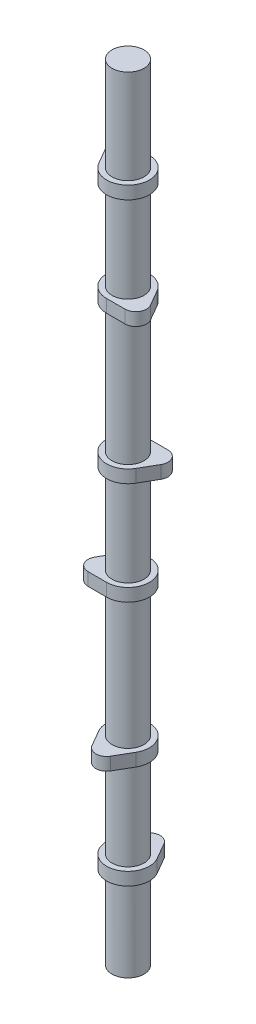
ISO-10303-21;
HEADER;
FILE_DESCRIPTION(('STEP AP214'),'2;1');
FILE_NAME('part.step','',(''),(''),'','','');
FILE_SCHEMA(('AUTOMOTIVE_DESIGN { 1 0 10303 214 1 1 1 1 }'));
ENDSEC;
DATA;
#1=APPLICATION_CONTEXT('core data for automotive mechanical design processes');
#2=APPLICATION_PROTOCOL_DEFINITION('international standard','automotive_design',2000,#1);
#3=PRODUCT_CONTEXT('',#1,'mechanical');
#4=PRODUCT('Part','Part','',(#3));
#5=PRODUCT_RELATED_PRODUCT_CATEGORY('part','',(#4));
#6=PRODUCT_DEFINITION_FORMATION('','',#4);
#7=PRODUCT_DEFINITION_CONTEXT('part definition',#1,'design');
#8=PRODUCT_DEFINITION('design','',#6,#7);
#9=PRODUCT_DEFINITION_SHAPE('','',#8);
#10=(LENGTH_UNIT() NAMED_UNIT(*) SI_UNIT(.MILLI.,.METRE.));
#11=(NAMED_UNIT(*) PLANE_ANGLE_UNIT() SI_UNIT($,.RADIAN.));
#12=(NAMED_UNIT(*) SI_UNIT($,.STERADIAN.) SOLID_ANGLE_UNIT());
#13=UNCERTAINTY_MEASURE_WITH_UNIT(LENGTH_MEASURE(1.E-05),#10,'distance_accuracy_value','');
#14=(GEOMETRIC_REPRESENTATION_CONTEXT(3) GLOBAL_UNCERTAINTY_ASSIGNED_CONTEXT((#13)) GLOBAL_UNIT_ASSIGNED_CONTEXT((#10,
#11,#12)) REPRESENTATION_CONTEXT('',''));
#15=CARTESIAN_POINT('',(0.,0.,0.));
#16=DIRECTION('',(0.,0.,1.));
#17=DIRECTION('',(1.,0.,0.));
#18=AXIS2_PLACEMENT_3D('',#15,#16,#17);
#19=CARTESIAN_POINT('',(0.,356.87,0.));
#20=DIRECTION('',(0.,-1.,0.));
#21=DIRECTION('',(-0.86602540378444,0.,-0.499999999999998));
#22=AXIS2_PLACEMENT_3D('',#19,#20,#21);
#23=CYLINDRICAL_SURFACE('',#22,12.7);
#24=CARTESIAN_POINT('',(0.,349.25,0.));
#25=DIRECTION('',(0.,1.,0.));
#26=DIRECTION('',(0.86602540378444,0.,0.499999999999998));
#27=AXIS2_PLACEMENT_3D('',#24,#25,#26);
#28=CIRCLE('',#27,12.7);
#29=CARTESIAN_POINT('',(-10.9985226280624,349.25,6.35000000000002));
#30=VERTEX_POINT('',#29);
#31=CARTESIAN_POINT('',(0.,349.25,-12.7));
#32=VERTEX_POINT('',#31);
#33=EDGE_CURVE('E460',#30,#32,#28,.T.);
#34=ORIENTED_EDGE('',*,*,#33,.T.);
#35=DIRECTION('',(0.,-1.,0.));
#36=VECTOR('',#35,1.);
#37=CARTESIAN_POINT('',(0.,356.87,-12.7));
#38=LINE('',#37,#36);
#39=CARTESIAN_POINT('',(0.,356.87,-12.7));
#40=VERTEX_POINT('',#39);
#41=EDGE_CURVE('E490',#40,#32,#38,.T.);
#42=ORIENTED_EDGE('',*,*,#41,.F.);
#43=CARTESIAN_POINT('',(0.,356.87,0.));
#44=DIRECTION('',(0.,1.,0.));
#45=DIRECTION('',(0.86602540378444,0.,0.499999999999998));
#46=AXIS2_PLACEMENT_3D('',#43,#44,#45);
#47=CIRCLE('',#46,12.7);
#48=CARTESIAN_POINT('',(-10.9985226280624,356.87,6.35000000000002));
#49=VERTEX_POINT('',#48);
#50=EDGE_CURVE('E461',#49,#40,#47,.T.);
#51=ORIENTED_EDGE('',*,*,#50,.F.);
#52=DIRECTION('',(0.,-1.,0.));
#53=VECTOR('',#52,1.);
#54=CARTESIAN_POINT('',(-10.9985226280624,356.87,6.35000000000002));
#55=LINE('',#54,#53);
#56=EDGE_CURVE('E471',#49,#30,#55,.T.);
#57=ORIENTED_EDGE('',*,*,#56,.T.);
#58=EDGE_LOOP('',(#34,#42,#51,#57));
#59=FACE_BOUND('',#58,.T.);
#60=ADVANCED_FACE('F45',(#59),#23,.T.);
#61=CARTESIAN_POINT('',(-10.9985226280624,356.87,-12.7));
#62=DIRECTION('',(0.,0.,1.));
#63=DIRECTION('',(1.,0.,0.));
#64=AXIS2_PLACEMENT_3D('',#61,#62,#63);
#65=PLANE('',#64);
#66=DIRECTION('',(-1.,0.,0.));
#67=VECTOR('',#66,1.);
#68=CARTESIAN_POINT('',(-10.9985226280624,349.25,-12.7));
#69=LINE('',#68,#67);
#70=CARTESIAN_POINT('',(-10.9985226280624,349.25,-12.7));
#71=VERTEX_POINT('',#70);
#72=EDGE_CURVE('E475',#32,#71,#69,.T.);
#73=ORIENTED_EDGE('',*,*,#72,.T.);
#74=DIRECTION('',(0.,-1.,0.));
#75=VECTOR('',#74,1.);
#76=CARTESIAN_POINT('',(-10.9985226280624,356.87,-12.7));
#77=LINE('',#76,#75);
#78=CARTESIAN_POINT('',(-10.9985226280624,356.87,-12.7));
#79=VERTEX_POINT('',#78);
#80=EDGE_CURVE('E487',#79,#71,#77,.T.);
#81=ORIENTED_EDGE('',*,*,#80,.F.);
#82=DIRECTION('',(-1.,0.,0.));
#83=VECTOR('',#82,1.);
#84=CARTESIAN_POINT('',(-10.9985226280624,356.87,-12.7));
#85=LINE('',#84,#83);
#86=EDGE_CURVE('E95',#40,#79,#85,.T.);
#87=ORIENTED_EDGE('',*,*,#86,.F.);
#88=ORIENTED_EDGE('',*,*,#41,.T.);
#89=EDGE_LOOP('',(#73,#81,#87,#88));
#90=FACE_BOUND('',#89,.T.);
#91=ADVANCED_FACE('F511',(#90),#65,.F.);
#92=CARTESIAN_POINT('',(-10.9985226280624,356.87,-6.34999999999997));
#93=DIRECTION('',(0.,-1.,0.));
#94=DIRECTION('',(-0.86602540378444,0.,-0.499999999999998));
#95=AXIS2_PLACEMENT_3D('',#92,#93,#94);
#96=CYLINDRICAL_SURFACE('',#95,6.35);
#97=CARTESIAN_POINT('',(-10.9985226280624,349.25,-6.34999999999997));
#98=DIRECTION('',(0.,1.,0.));
#99=DIRECTION('',(0.86602540378444,0.,0.499999999999998));
#100=AXIS2_PLACEMENT_3D('',#97,#98,#99);
#101=CIRCLE('',#100,6.35);
#102=CARTESIAN_POINT('',(-16.4977839420936,349.25,-3.17499999999996));
#103=VERTEX_POINT('',#102);
#104=EDGE_CURVE('E81',#71,#103,#101,.T.);
#105=ORIENTED_EDGE('',*,*,#104,.T.);
#106=DIRECTION('',(0.,-1.,0.));
#107=VECTOR('',#106,1.);
#108=CARTESIAN_POINT('',(-16.4977839420936,356.87,-3.17499999999996));
#109=LINE('',#108,#107);
#110=CARTESIAN_POINT('',(-16.4977839420936,356.87,-3.17499999999996));
#111=VERTEX_POINT('',#110);
#112=EDGE_CURVE('E484',#111,#103,#109,.T.);
#113=ORIENTED_EDGE('',*,*,#112,.F.);
#114=CARTESIAN_POINT('',(-10.9985226280624,356.87,-6.34999999999997));
#115=DIRECTION('',(0.,1.,0.));
#116=DIRECTION('',(0.86602540378444,0.,0.499999999999998));
#117=AXIS2_PLACEMENT_3D('',#114,#115,#116);
#118=CIRCLE('',#117,6.35);
#119=EDGE_CURVE('E466',#79,#111,#118,.T.);
#120=ORIENTED_EDGE('',*,*,#119,.F.);
#121=ORIENTED_EDGE('',*,*,#80,.T.);
#122=EDGE_LOOP('',(#105,#113,#120,#121));
#123=FACE_BOUND('',#122,.T.);
#124=ADVANCED_FACE('F510',(#123),#96,.T.);
#125=CARTESIAN_POINT('',(-10.9985226280624,356.87,6.35000000000002));
#126=DIRECTION('',(0.866025403784437,0.,-0.500000000000002));
#127=DIRECTION('',(-0.500000000000002,0.,-0.866025403784437));
#128=AXIS2_PLACEMENT_3D('',#125,#126,#127);
#129=PLANE('',#128);
#130=DIRECTION('',(0.500000000000002,0.,0.866025403784437));
#131=VECTOR('',#130,1.);
#132=CARTESIAN_POINT('',(-10.9985226280624,349.25,6.35000000000002));
#133=LINE('',#132,#131);
#134=EDGE_CURVE('E87',#103,#30,#133,.T.);
#135=ORIENTED_EDGE('',*,*,#134,.T.);
#136=ORIENTED_EDGE('',*,*,#56,.F.);
#137=DIRECTION('',(0.500000000000002,0.,0.866025403784437));
#138=VECTOR('',#137,1.);
#139=CARTESIAN_POINT('',(-10.9985226280624,356.87,6.35000000000002));
#140=LINE('',#139,#138);
#141=EDGE_CURVE('E63',#111,#49,#140,.T.);
#142=ORIENTED_EDGE('',*,*,#141,.F.);
#143=ORIENTED_EDGE('',*,*,#112,.T.);
#144=EDGE_LOOP('',(#135,#136,#142,#143));
#145=FACE_BOUND('',#144,.T.);
#146=ADVANCED_FACE('F508',(#145),#129,.F.);
#147=CARTESIAN_POINT('',(0.,356.87,0.));
#148=DIRECTION('',(0.,1.,0.));
#149=DIRECTION('',(0.86602540378444,0.,0.499999999999998));
#150=AXIS2_PLACEMENT_3D('',#147,#148,#149);
#151=PLANE('',#150);
#152=CARTESIAN_POINT('',(0.,356.87,0.));
#153=DIRECTION('',(0.,1.,0.));
#154=DIRECTION('',(-0.866025403784443,0.,-0.499999999999992));
#155=AXIS2_PLACEMENT_3D('',#152,#153,#154);
#156=CIRCLE('',#155,9.5);
#157=CARTESIAN_POINT('',(-8.22724133595221,356.87,-4.74999999999992));
#158=VERTEX_POINT('',#157);
#159=EDGE_CURVE('E456',#158,#158,#156,.F.);
#160=ORIENTED_EDGE('',*,*,#159,.T.);
#161=EDGE_LOOP('',(#160));
#162=FACE_BOUND('',#161,.T.);
#163=ORIENTED_EDGE('',*,*,#50,.T.);
#164=ORIENTED_EDGE('',*,*,#86,.T.);
#165=ORIENTED_EDGE('',*,*,#119,.T.);
#166=ORIENTED_EDGE('',*,*,#141,.T.);
#167=EDGE_LOOP('',(#163,#164,#165,#166));
#168=FACE_BOUND('',#167,.T.);
#169=ADVANCED_FACE('F502',(#162,#168),#151,.T.);
#170=CARTESIAN_POINT('',(0.,349.25,0.));
#171=DIRECTION('',(0.,1.,0.));
#172=DIRECTION('',(0.86602540378444,0.,0.499999999999998));
#173=AXIS2_PLACEMENT_3D('',#170,#171,#172);
#174=PLANE('',#173);
#175=CARTESIAN_POINT('',(0.,349.25,0.));
#176=DIRECTION('',(0.,1.,0.));
#177=DIRECTION('',(-0.866025403784443,0.,-0.499999999999992));
#178=AXIS2_PLACEMENT_3D('',#175,#176,#177);
#179=CIRCLE('',#178,9.5);
#180=CARTESIAN_POINT('',(-8.22724133595221,349.25,-4.74999999999992));
#181=VERTEX_POINT('',#180);
#182=EDGE_CURVE('E55',#181,#181,#179,.F.);
#183=ORIENTED_EDGE('',*,*,#182,.F.);
#184=EDGE_LOOP('',(#183));
#185=FACE_BOUND('',#184,.T.);
#186=ORIENTED_EDGE('',*,*,#33,.F.);
#187=ORIENTED_EDGE('',*,*,#134,.F.);
#188=ORIENTED_EDGE('',*,*,#104,.F.);
#189=ORIENTED_EDGE('',*,*,#72,.F.);
#190=EDGE_LOOP('',(#186,#187,#188,#189));
#191=FACE_BOUND('',#190,.T.);
#192=ADVANCED_FACE('F499',(#185,#191),#174,.F.);
#193=CARTESIAN_POINT('',(0.,412.75,0.));
#194=DIRECTION('',(0.,-1.,0.));
#195=DIRECTION('',(0.866025403784443,0.,0.499999999999992));
#196=AXIS2_PLACEMENT_3D('',#193,#194,#195);
#197=CYLINDRICAL_SURFACE('',#196,9.5);
#198=CARTESIAN_POINT('',(0.,295.91,0.));
#199=DIRECTION('',(0.,1.,0.));
#200=DIRECTION('',(-0.866025403784443,0.,-0.499999999999992));
#201=AXIS2_PLACEMENT_3D('',#198,#199,#200);
#202=CIRCLE('',#201,9.5);
#203=CARTESIAN_POINT('',(-8.22724133595221,295.91,-4.74999999999992));
#204=VERTEX_POINT('',#203);
#205=EDGE_CURVE('E48',#204,#204,#202,.T.);
#206=ORIENTED_EDGE('',*,*,#205,.T.);
#207=EDGE_LOOP('',(#206));
#208=FACE_BOUND('',#207,.T.);
#209=ORIENTED_EDGE('',*,*,#182,.T.);
#210=EDGE_LOOP('',(#209));
#211=FACE_BOUND('',#210,.T.);
#212=ADVANCED_FACE('F497',(#208,#211),#197,.T.);
#213=ORIENTED_EDGE('',*,*,#159,.F.);
#214=EDGE_LOOP('',(#213));
#215=FACE_BOUND('',#214,.T.);
#216=CARTESIAN_POINT('',(0.,412.75,0.));
#217=DIRECTION('',(0.,1.,0.));
#218=DIRECTION('',(-0.866025403784443,0.,-0.499999999999992));
#219=AXIS2_PLACEMENT_3D('',#216,#217,#218);
#220=CIRCLE('',#219,9.5);
#221=CARTESIAN_POINT('',(-8.22724133595221,412.75,-4.74999999999992));
#222=VERTEX_POINT('',#221);
#223=EDGE_CURVE('E452',#222,#222,#220,.T.);
#224=ORIENTED_EDGE('',*,*,#223,.F.);
#225=EDGE_LOOP('',(#224));
#226=FACE_BOUND('',#225,.T.);
#227=ADVANCED_FACE('F524',(#215,#226),#197,.T.);
#228=CARTESIAN_POINT('',(0.,412.75,0.));
#229=DIRECTION('',(0.,1.,0.));
#230=DIRECTION('',(-0.866025403784443,0.,-0.499999999999992));
#231=AXIS2_PLACEMENT_3D('',#228,#229,#230);
#232=PLANE('',#231);
#233=ORIENTED_EDGE('',*,*,#223,.T.);
#234=EDGE_LOOP('',(#233));
#235=FACE_BOUND('',#234,.T.);
#236=ADVANCED_FACE('F527',(#235),#232,.T.);
#237=CARTESIAN_POINT('',(0.,295.91,0.));
#238=DIRECTION('',(0.,-1.,0.));
#239=DIRECTION('',(0.866025403784443,0.,0.499999999999992));
#240=AXIS2_PLACEMENT_3D('',#237,#238,#239);
#241=CYLINDRICAL_SURFACE('',#240,12.7);
#242=CARTESIAN_POINT('',(0.,288.29,0.));
#243=DIRECTION('',(0.,1.,0.));
#244=DIRECTION('',(-0.866025403784443,0.,-0.499999999999992));
#245=AXIS2_PLACEMENT_3D('',#242,#243,#244);
#246=CIRCLE('',#245,12.7);
#247=CARTESIAN_POINT('',(10.9985226280623,288.29,-6.3500000000001));
#248=VERTEX_POINT('',#247);
#249=CARTESIAN_POINT('',(1.11022302462516E-13,288.29,12.7));
#250=VERTEX_POINT('',#249);
#251=EDGE_CURVE('E407',#248,#250,#246,.T.);
#252=ORIENTED_EDGE('',*,*,#251,.T.);
#253=DIRECTION('',(0.,-1.,0.));
#254=VECTOR('',#253,1.);
#255=CARTESIAN_POINT('',(1.11022302462516E-13,295.91,12.7));
#256=LINE('',#255,#254);
#257=CARTESIAN_POINT('',(1.11022302462516E-13,295.91,12.7));
#258=VERTEX_POINT('',#257);
#259=EDGE_CURVE('E448',#258,#250,#256,.T.);
#260=ORIENTED_EDGE('',*,*,#259,.F.);
#261=CARTESIAN_POINT('',(0.,295.91,0.));
#262=DIRECTION('',(0.,1.,0.));
#263=DIRECTION('',(-0.866025403784443,0.,-0.499999999999992));
#264=AXIS2_PLACEMENT_3D('',#261,#262,#263);
#265=CIRCLE('',#264,12.7);
#266=CARTESIAN_POINT('',(10.9985226280623,295.91,-6.3500000000001));
#267=VERTEX_POINT('',#266);
#268=EDGE_CURVE('E411',#267,#258,#265,.T.);
#269=ORIENTED_EDGE('',*,*,#268,.F.);
#270=DIRECTION('',(0.,-1.,0.));
#271=VECTOR('',#270,1.);
#272=CARTESIAN_POINT('',(10.9985226280623,295.91,-6.3500000000001));
#273=LINE('',#272,#271);
#274=EDGE_CURVE('E425',#267,#248,#273,.T.);
#275=ORIENTED_EDGE('',*,*,#274,.T.);
#276=EDGE_LOOP('',(#252,#260,#269,#275));
#277=FACE_BOUND('',#276,.T.);
#278=ADVANCED_FACE('F532',(#277),#241,.T.);
#279=CARTESIAN_POINT('',(10.9985226280625,295.91,12.6999999999999));
#280=DIRECTION('',(0.,0.,-1.));
#281=DIRECTION('',(-1.,0.,0.));
#282=AXIS2_PLACEMENT_3D('',#279,#280,#281);
#283=PLANE('',#282);
#284=DIRECTION('',(1.,0.,0.));
#285=VECTOR('',#284,1.);
#286=CARTESIAN_POINT('',(10.9985226280625,288.29,12.6999999999999));
#287=LINE('',#286,#285);
#288=CARTESIAN_POINT('',(10.9985226280625,288.29,12.6999999999999));
#289=VERTEX_POINT('',#288);
#290=EDGE_CURVE('E429',#250,#289,#287,.T.);
#291=ORIENTED_EDGE('',*,*,#290,.T.);
#292=DIRECTION('',(0.,-1.,0.));
#293=VECTOR('',#292,1.);
#294=CARTESIAN_POINT('',(10.9985226280625,295.91,12.6999999999999));
#295=LINE('',#294,#293);
#296=CARTESIAN_POINT('',(10.9985226280625,295.91,12.6999999999999));
#297=VERTEX_POINT('',#296);
#298=EDGE_CURVE('E444',#297,#289,#295,.T.);
#299=ORIENTED_EDGE('',*,*,#298,.F.);
#300=DIRECTION('',(1.,0.,0.));
#301=VECTOR('',#300,1.);
#302=CARTESIAN_POINT('',(10.9985226280625,295.91,12.6999999999999));
#303=LINE('',#302,#301);
#304=EDGE_CURVE('E415',#258,#297,#303,.T.);
#305=ORIENTED_EDGE('',*,*,#304,.F.);
#306=ORIENTED_EDGE('',*,*,#259,.T.);
#307=EDGE_LOOP('',(#291,#299,#305,#306));
#308=FACE_BOUND('',#307,.T.);
#309=ADVANCED_FACE('F536',(#308),#283,.F.);
#310=CARTESIAN_POINT('',(10.9985226280624,295.91,6.3499999999999));
#311=DIRECTION('',(0.,-1.,0.));
#312=DIRECTION('',(0.866025403784443,0.,0.499999999999992));
#313=AXIS2_PLACEMENT_3D('',#310,#311,#312);
#314=CYLINDRICAL_SURFACE('',#313,6.35);
#315=CARTESIAN_POINT('',(10.9985226280624,288.29,6.3499999999999));
#316=DIRECTION('',(0.,1.,0.));
#317=DIRECTION('',(-0.866025403784443,0.,-0.499999999999992));
#318=AXIS2_PLACEMENT_3D('',#315,#316,#317);
#319=CIRCLE('',#318,6.35);
#320=CARTESIAN_POINT('',(16.4977839420936,288.29,3.17499999999985));
#321=VERTEX_POINT('',#320);
#322=EDGE_CURVE('E432',#289,#321,#319,.T.);
#323=ORIENTED_EDGE('',*,*,#322,.T.);
#324=DIRECTION('',(0.,-1.,0.));
#325=VECTOR('',#324,1.);
#326=CARTESIAN_POINT('',(16.4977839420936,295.91,3.17499999999985));
#327=LINE('',#326,#325);
#328=CARTESIAN_POINT('',(16.4977839420936,295.91,3.17499999999985));
#329=VERTEX_POINT('',#328);
#330=EDGE_CURVE('E440',#329,#321,#327,.T.);
#331=ORIENTED_EDGE('',*,*,#330,.F.);
#332=CARTESIAN_POINT('',(10.9985226280624,295.91,6.3499999999999));
#333=DIRECTION('',(0.,1.,0.));
#334=DIRECTION('',(-0.866025403784443,0.,-0.499999999999992));
#335=AXIS2_PLACEMENT_3D('',#332,#333,#334);
#336=CIRCLE('',#335,6.35);
#337=EDGE_CURVE('E419',#297,#329,#336,.T.);
#338=ORIENTED_EDGE('',*,*,#337,.F.);
#339=ORIENTED_EDGE('',*,*,#298,.T.);
#340=EDGE_LOOP('',(#323,#331,#338,#339));
#341=FACE_BOUND('',#340,.T.);
#342=ADVANCED_FACE('F540',(#341),#314,.T.);
#343=CARTESIAN_POINT('',(10.9985226280623,295.91,-6.3500000000001));
#344=DIRECTION('',(-0.866025403784434,0.,0.500000000000008));
#345=DIRECTION('',(0.500000000000008,0.,0.866025403784434));
#346=AXIS2_PLACEMENT_3D('',#343,#344,#345);
#347=PLANE('',#346);
#348=DIRECTION('',(-0.500000000000008,0.,-0.866025403784434));
#349=VECTOR('',#348,1.);
#350=CARTESIAN_POINT('',(10.9985226280623,288.29,-6.3500000000001));
#351=LINE('',#350,#349);
#352=EDGE_CURVE('E416',#321,#248,#351,.T.);
#353=ORIENTED_EDGE('',*,*,#352,.T.);
#354=ORIENTED_EDGE('',*,*,#274,.F.);
#355=DIRECTION('',(-0.500000000000008,0.,-0.866025403784434));
#356=VECTOR('',#355,1.);
#357=CARTESIAN_POINT('',(10.9985226280623,295.91,-6.3500000000001));
#358=LINE('',#357,#356);
#359=EDGE_CURVE('E422',#329,#267,#358,.T.);
#360=ORIENTED_EDGE('',*,*,#359,.F.);
#361=ORIENTED_EDGE('',*,*,#330,.T.);
#362=EDGE_LOOP('',(#353,#354,#360,#361));
#363=FACE_BOUND('',#362,.T.);
#364=ADVANCED_FACE('F544',(#363),#347,.F.);
#365=CARTESIAN_POINT('',(0.,295.91,0.));
#366=DIRECTION('',(0.,1.,0.));
#367=DIRECTION('',(-0.866025403784443,0.,-0.499999999999992));
#368=AXIS2_PLACEMENT_3D('',#365,#366,#367);
#369=PLANE('',#368);
#370=ORIENTED_EDGE('',*,*,#205,.F.);
#371=EDGE_LOOP('',(#370));
#372=FACE_BOUND('',#371,.T.);
#373=ORIENTED_EDGE('',*,*,#268,.T.);
#374=ORIENTED_EDGE('',*,*,#304,.T.);
#375=ORIENTED_EDGE('',*,*,#337,.T.);
#376=ORIENTED_EDGE('',*,*,#359,.T.);
#377=EDGE_LOOP('',(#373,#374,#375,#376));
#378=FACE_BOUND('',#377,.T.);
#379=ADVANCED_FACE('F548',(#372,#378),#369,.T.);
#380=CARTESIAN_POINT('',(0.,288.29,0.));
#381=DIRECTION('',(0.,1.,0.));
#382=DIRECTION('',(-0.866025403784443,0.,-0.499999999999992));
#383=AXIS2_PLACEMENT_3D('',#380,#381,#382);
#384=PLANE('',#383);
#385=CARTESIAN_POINT('',(0.,288.29,0.));
#386=DIRECTION('',(0.,1.,0.));
#387=DIRECTION('',(-0.866025403784443,0.,-0.499999999999992));
#388=AXIS2_PLACEMENT_3D('',#385,#386,#387);
#389=CIRCLE('',#388,9.5);
#390=CARTESIAN_POINT('',(-8.22724133595221,288.29,-4.74999999999992));
#391=VERTEX_POINT('',#390);
#392=EDGE_CURVE('E11',#391,#391,#389,.T.);
#393=ORIENTED_EDGE('',*,*,#392,.T.);
#394=EDGE_LOOP('',(#393));
#395=FACE_BOUND('',#394,.T.);
#396=ORIENTED_EDGE('',*,*,#251,.F.);
#397=ORIENTED_EDGE('',*,*,#352,.F.);
#398=ORIENTED_EDGE('',*,*,#322,.F.);
#399=ORIENTED_EDGE('',*,*,#290,.F.);
#400=EDGE_LOOP('',(#396,#397,#398,#399));
#401=FACE_BOUND('',#400,.T.);
#402=ADVANCED_FACE('F550',(#395,#401),#384,.F.);
#403=ORIENTED_EDGE('',*,*,#392,.F.);
#404=EDGE_LOOP('',(#403));
#405=FACE_BOUND('',#404,.T.);
#406=CARTESIAN_POINT('',(0.,210.82,0.));
#407=DIRECTION('',(0.,1.,0.));
#408=DIRECTION('',(0.866025403784436,0.,-0.500000000000004));
#409=AXIS2_PLACEMENT_3D('',#406,#407,#408);
#410=CIRCLE('',#409,9.5);
#411=CARTESIAN_POINT('',(8.22724133595215,210.82,-4.75000000000004));
#412=VERTEX_POINT('',#411);
#413=EDGE_CURVE('E353',#412,#412,#410,.F.);
#414=ORIENTED_EDGE('',*,*,#413,.F.);
#415=EDGE_LOOP('',(#414));
#416=FACE_BOUND('',#415,.T.);
#417=ADVANCED_FACE('F529',(#405,#416),#197,.T.);
#418=CARTESIAN_POINT('',(0.,210.82,0.));
#419=DIRECTION('',(0.,-1.,0.));
#420=DIRECTION('',(0.86602540378444,0.,-0.499999999999998));
#421=AXIS2_PLACEMENT_3D('',#418,#419,#420);
#422=CYLINDRICAL_SURFACE('',#421,12.7);
#423=CARTESIAN_POINT('',(0.,203.2,0.));
#424=DIRECTION('',(0.,1.,0.));
#425=DIRECTION('',(-0.86602540378444,0.,0.499999999999998));
#426=AXIS2_PLACEMENT_3D('',#423,#424,#425);
#427=CIRCLE('',#426,12.7);
#428=CARTESIAN_POINT('',(0.,203.2,-12.7));
#429=VERTEX_POINT('',#428);
#430=CARTESIAN_POINT('',(10.9985226280624,203.2,6.35000000000003));
#431=VERTEX_POINT('',#430);
#432=EDGE_CURVE('E357',#429,#431,#427,.T.);
#433=ORIENTED_EDGE('',*,*,#432,.T.);
#434=DIRECTION('',(0.,-1.,0.));
#435=VECTOR('',#434,1.);
#436=CARTESIAN_POINT('',(10.9985226280624,210.82,6.35000000000003));
#437=LINE('',#436,#435);
#438=CARTESIAN_POINT('',(10.9985226280624,210.82,6.35000000000003));
#439=VERTEX_POINT('',#438);
#440=EDGE_CURVE('E395',#439,#431,#437,.T.);
#441=ORIENTED_EDGE('',*,*,#440,.F.);
#442=CARTESIAN_POINT('',(0.,210.82,0.));
#443=DIRECTION('',(0.,1.,0.));
#444=DIRECTION('',(-0.86602540378444,0.,0.499999999999998));
#445=AXIS2_PLACEMENT_3D('',#442,#443,#444);
#446=CIRCLE('',#445,12.7);
#447=CARTESIAN_POINT('',(0.,210.82,-12.7));
#448=VERTEX_POINT('',#447);
#449=EDGE_CURVE('E358',#448,#439,#446,.T.);
#450=ORIENTED_EDGE('',*,*,#449,.F.);
#451=DIRECTION('',(0.,-1.,0.));
#452=VECTOR('',#451,1.);
#453=CARTESIAN_POINT('',(0.,210.82,-12.7));
#454=LINE('',#453,#452);
#455=EDGE_CURVE('E372',#448,#429,#454,.T.);
#456=ORIENTED_EDGE('',*,*,#455,.T.);
#457=EDGE_LOOP('',(#433,#441,#450,#456));
#458=FACE_BOUND('',#457,.T.);
#459=ADVANCED_FACE('F557',(#458),#422,.T.);
#460=CARTESIAN_POINT('',(16.4977839420936,210.82,-3.17499999999996));
#461=DIRECTION('',(-0.866025403784438,0.,-0.500000000000002));
#462=DIRECTION('',(-0.500000000000002,0.,0.866025403784438));
#463=AXIS2_PLACEMENT_3D('',#460,#461,#462);
#464=PLANE('',#463);
#465=DIRECTION('',(0.500000000000002,0.,-0.866025403784438));
#466=VECTOR('',#465,1.);
#467=CARTESIAN_POINT('',(16.4977839420936,203.2,-3.17499999999996));
#468=LINE('',#467,#466);
#469=CARTESIAN_POINT('',(16.4977839420936,203.2,-3.17499999999996));
#470=VERTEX_POINT('',#469);
#471=EDGE_CURVE('E376',#431,#470,#468,.T.);
#472=ORIENTED_EDGE('',*,*,#471,.T.);
#473=DIRECTION('',(0.,-1.,0.));
#474=VECTOR('',#473,1.);
#475=CARTESIAN_POINT('',(16.4977839420936,210.82,-3.17499999999996));
#476=LINE('',#475,#474);
#477=CARTESIAN_POINT('',(16.4977839420936,210.82,-3.17499999999996));
#478=VERTEX_POINT('',#477);
#479=EDGE_CURVE('E391',#478,#470,#476,.T.);
#480=ORIENTED_EDGE('',*,*,#479,.F.);
#481=DIRECTION('',(0.500000000000002,0.,-0.866025403784438));
#482=VECTOR('',#481,1.);
#483=CARTESIAN_POINT('',(16.4977839420936,210.82,-3.17499999999996));
#484=LINE('',#483,#482);
#485=EDGE_CURVE('E362',#439,#478,#484,.T.);
#486=ORIENTED_EDGE('',*,*,#485,.F.);
#487=ORIENTED_EDGE('',*,*,#440,.T.);
#488=EDGE_LOOP('',(#472,#480,#486,#487));
#489=FACE_BOUND('',#488,.T.);
#490=ADVANCED_FACE('F560',(#489),#464,.F.);
#491=CARTESIAN_POINT('',(10.9985226280624,210.82,-6.34999999999997));
#492=DIRECTION('',(0.,-1.,0.));
#493=DIRECTION('',(0.86602540378444,0.,-0.499999999999998));
#494=AXIS2_PLACEMENT_3D('',#491,#492,#493);
#495=CYLINDRICAL_SURFACE('',#494,6.35);
#496=CARTESIAN_POINT('',(10.9985226280624,203.2,-6.34999999999997));
#497=DIRECTION('',(0.,1.,0.));
#498=DIRECTION('',(-0.86602540378444,0.,0.499999999999998));
#499=AXIS2_PLACEMENT_3D('',#496,#497,#498);
#500=CIRCLE('',#499,6.35);
#501=CARTESIAN_POINT('',(10.9985226280624,203.2,-12.7));
#502=VERTEX_POINT('',#501);
#503=EDGE_CURVE('E379',#470,#502,#500,.T.);
#504=ORIENTED_EDGE('',*,*,#503,.T.);
#505=DIRECTION('',(0.,-1.,0.));
#506=VECTOR('',#505,1.);
#507=CARTESIAN_POINT('',(10.9985226280624,210.82,-12.7));
#508=LINE('',#507,#506);
#509=CARTESIAN_POINT('',(10.9985226280624,210.82,-12.7));
#510=VERTEX_POINT('',#509);
#511=EDGE_CURVE('E387',#510,#502,#508,.T.);
#512=ORIENTED_EDGE('',*,*,#511,.F.);
#513=CARTESIAN_POINT('',(10.9985226280624,210.82,-6.34999999999997));
#514=DIRECTION('',(0.,1.,0.));
#515=DIRECTION('',(-0.86602540378444,0.,0.499999999999998));
#516=AXIS2_PLACEMENT_3D('',#513,#514,#515);
#517=CIRCLE('',#516,6.35);
#518=EDGE_CURVE('E366',#478,#510,#517,.T.);
#519=ORIENTED_EDGE('',*,*,#518,.F.);
#520=ORIENTED_EDGE('',*,*,#479,.T.);
#521=EDGE_LOOP('',(#504,#512,#519,#520));
#522=FACE_BOUND('',#521,.T.);
#523=ADVANCED_FACE('F564',(#522),#495,.T.);
#524=CARTESIAN_POINT('',(0.,210.82,-12.7));
#525=DIRECTION('',(0.,0.,1.));
#526=DIRECTION('',(1.,0.,0.));
#527=AXIS2_PLACEMENT_3D('',#524,#525,#526);
#528=PLANE('',#527);
#529=DIRECTION('',(-1.,0.,0.));
#530=VECTOR('',#529,1.);
#531=CARTESIAN_POINT('',(0.,203.2,-12.7));
#532=LINE('',#531,#530);
#533=EDGE_CURVE('E363',#502,#429,#532,.T.);
#534=ORIENTED_EDGE('',*,*,#533,.T.);
#535=ORIENTED_EDGE('',*,*,#455,.F.);
#536=DIRECTION('',(-1.,0.,0.));
#537=VECTOR('',#536,1.);
#538=CARTESIAN_POINT('',(0.,210.82,-12.7));
#539=LINE('',#538,#537);
#540=EDGE_CURVE('E369',#510,#448,#539,.T.);
#541=ORIENTED_EDGE('',*,*,#540,.F.);
#542=ORIENTED_EDGE('',*,*,#511,.T.);
#543=EDGE_LOOP('',(#534,#535,#541,#542));
#544=FACE_BOUND('',#543,.T.);
#545=ADVANCED_FACE('F568',(#544),#528,.F.);
#546=CARTESIAN_POINT('',(0.,210.82,0.));
#547=DIRECTION('',(0.,1.,0.));
#548=DIRECTION('',(-0.86602540378444,0.,0.499999999999998));
#549=AXIS2_PLACEMENT_3D('',#546,#547,#548);
#550=PLANE('',#549);
#551=ORIENTED_EDGE('',*,*,#413,.T.);
#552=EDGE_LOOP('',(#551));
#553=FACE_BOUND('',#552,.T.);
#554=ORIENTED_EDGE('',*,*,#449,.T.);
#555=ORIENTED_EDGE('',*,*,#485,.T.);
#556=ORIENTED_EDGE('',*,*,#518,.T.);
#557=ORIENTED_EDGE('',*,*,#540,.T.);
#558=EDGE_LOOP('',(#554,#555,#556,#557));
#559=FACE_BOUND('',#558,.T.);
#560=ADVANCED_FACE('F572',(#553,#559),#550,.T.);
#561=CARTESIAN_POINT('',(0.,203.2,0.));
#562=DIRECTION('',(0.,1.,0.));
#563=DIRECTION('',(-0.86602540378444,0.,0.499999999999998));
#564=AXIS2_PLACEMENT_3D('',#561,#562,#563);
#565=PLANE('',#564);
#566=CARTESIAN_POINT('',(0.,203.2,0.));
#567=DIRECTION('',(0.,1.,0.));
#568=DIRECTION('',(0.866025403784436,0.,-0.500000000000004));
#569=AXIS2_PLACEMENT_3D('',#566,#567,#568);
#570=CIRCLE('',#569,9.5);
#571=CARTESIAN_POINT('',(8.22724133595215,203.2,-4.75000000000004));
#572=VERTEX_POINT('',#571);
#573=EDGE_CURVE('E399',#572,#572,#570,.F.);
#574=ORIENTED_EDGE('',*,*,#573,.F.);
#575=EDGE_LOOP('',(#574));
#576=FACE_BOUND('',#575,.T.);
#577=ORIENTED_EDGE('',*,*,#432,.F.);
#578=ORIENTED_EDGE('',*,*,#533,.F.);
#579=ORIENTED_EDGE('',*,*,#503,.F.);
#580=ORIENTED_EDGE('',*,*,#471,.F.);
#581=EDGE_LOOP('',(#577,#578,#579,#580));
#582=FACE_BOUND('',#581,.T.);
#583=ADVANCED_FACE('F574',(#576,#582),#565,.F.);
#584=CARTESIAN_POINT('',(0.,266.7,0.));
#585=DIRECTION('',(0.,-1.,0.));
#586=DIRECTION('',(-0.866025403784436,0.,0.500000000000004));
#587=AXIS2_PLACEMENT_3D('',#584,#585,#586);
#588=CYLINDRICAL_SURFACE('',#587,9.5);
#589=CARTESIAN_POINT('',(0.,149.86,0.));
#590=DIRECTION('',(0.,1.,0.));
#591=DIRECTION('',(0.866025403784436,0.,-0.500000000000004));
#592=AXIS2_PLACEMENT_3D('',#589,#590,#591);
#593=CIRCLE('',#592,9.5);
#594=CARTESIAN_POINT('',(8.22724133595215,149.86,-4.75000000000004));
#595=VERTEX_POINT('',#594);
#596=EDGE_CURVE('E352',#595,#595,#593,.T.);
#597=ORIENTED_EDGE('',*,*,#596,.T.);
#598=EDGE_LOOP('',(#597));
#599=FACE_BOUND('',#598,.T.);
#600=ORIENTED_EDGE('',*,*,#573,.T.);
#601=EDGE_LOOP('',(#600));
#602=FACE_BOUND('',#601,.T.);
#603=ADVANCED_FACE('F577',(#599,#602),#588,.T.);
#604=CARTESIAN_POINT('',(0.,149.86,0.));
#605=DIRECTION('',(0.,-1.,0.));
#606=DIRECTION('',(-0.866025403784436,0.,0.500000000000004));
#607=AXIS2_PLACEMENT_3D('',#604,#605,#606);
#608=CYLINDRICAL_SURFACE('',#607,12.7);
#609=CARTESIAN_POINT('',(0.,142.24,0.));
#610=DIRECTION('',(0.,1.,0.));
#611=DIRECTION('',(0.866025403784436,0.,-0.500000000000004));
#612=AXIS2_PLACEMENT_3D('',#609,#610,#611);
#613=CIRCLE('',#612,12.7);
#614=CARTESIAN_POINT('',(0.,142.24,12.7));
#615=VERTEX_POINT('',#614);
#616=CARTESIAN_POINT('',(-10.9985226280624,142.24,-6.34999999999995));
#617=VERTEX_POINT('',#616);
#618=EDGE_CURVE('E309',#615,#617,#613,.T.);
#619=ORIENTED_EDGE('',*,*,#618,.T.);
#620=DIRECTION('',(0.,-1.,0.));
#621=VECTOR('',#620,1.);
#622=CARTESIAN_POINT('',(-10.9985226280624,149.86,-6.34999999999995));
#623=LINE('',#622,#621);
#624=CARTESIAN_POINT('',(-10.9985226280624,149.86,-6.34999999999995));
#625=VERTEX_POINT('',#624);
#626=EDGE_CURVE('E348',#625,#617,#623,.T.);
#627=ORIENTED_EDGE('',*,*,#626,.F.);
#628=CARTESIAN_POINT('',(0.,149.86,0.));
#629=DIRECTION('',(0.,1.,0.));
#630=DIRECTION('',(0.866025403784436,0.,-0.500000000000004));
#631=AXIS2_PLACEMENT_3D('',#628,#629,#630);
#632=CIRCLE('',#631,12.7);
#633=CARTESIAN_POINT('',(0.,149.86,12.7));
#634=VERTEX_POINT('',#633);
#635=EDGE_CURVE('E311',#634,#625,#632,.T.);
#636=ORIENTED_EDGE('',*,*,#635,.F.);
#637=DIRECTION('',(0.,-1.,0.));
#638=VECTOR('',#637,1.);
#639=CARTESIAN_POINT('',(0.,149.86,12.7));
#640=LINE('',#639,#638);
#641=EDGE_CURVE('E325',#634,#615,#640,.T.);
#642=ORIENTED_EDGE('',*,*,#641,.T.);
#643=EDGE_LOOP('',(#619,#627,#636,#642));
#644=FACE_BOUND('',#643,.T.);
#645=ADVANCED_FACE('F588',(#644),#608,.T.);
#646=CARTESIAN_POINT('',(-16.4977839420935,149.86,3.17500000000007));
#647=DIRECTION('',(0.866025403784441,0.,0.499999999999996));
#648=DIRECTION('',(0.499999999999996,0.,-0.866025403784441));
#649=AXIS2_PLACEMENT_3D('',#646,#647,#648);
#650=PLANE('',#649);
#651=DIRECTION('',(-0.499999999999996,0.,0.866025403784441));
#652=VECTOR('',#651,1.);
#653=CARTESIAN_POINT('',(-16.4977839420935,142.24,3.17500000000007));
#654=LINE('',#653,#652);
#655=CARTESIAN_POINT('',(-16.4977839420935,142.24,3.17500000000008));
#656=VERTEX_POINT('',#655);
#657=EDGE_CURVE('E329',#617,#656,#654,.T.);
#658=ORIENTED_EDGE('',*,*,#657,.T.);
#659=DIRECTION('',(0.,-1.,0.));
#660=VECTOR('',#659,1.);
#661=CARTESIAN_POINT('',(-16.4977839420935,149.86,3.17500000000008));
#662=LINE('',#661,#660);
#663=CARTESIAN_POINT('',(-16.4977839420935,149.86,3.17500000000008));
#664=VERTEX_POINT('',#663);
#665=EDGE_CURVE('E344',#664,#656,#662,.T.);
#666=ORIENTED_EDGE('',*,*,#665,.F.);
#667=DIRECTION('',(-0.499999999999996,0.,0.866025403784441));
#668=VECTOR('',#667,1.);
#669=CARTESIAN_POINT('',(-16.4977839420935,149.86,3.17500000000007));
#670=LINE('',#669,#668);
#671=EDGE_CURVE('E315',#625,#664,#670,.T.);
#672=ORIENTED_EDGE('',*,*,#671,.F.);
#673=ORIENTED_EDGE('',*,*,#626,.T.);
#674=EDGE_LOOP('',(#658,#666,#672,#673));
#675=FACE_BOUND('',#674,.T.);
#676=ADVANCED_FACE('F591',(#675),#650,.F.);
#677=CARTESIAN_POINT('',(-10.9985226280623,149.86,6.35000000000005));
#678=DIRECTION('',(0.,-1.,0.));
#679=DIRECTION('',(-0.866025403784436,0.,0.500000000000004));
#680=AXIS2_PLACEMENT_3D('',#677,#678,#679);
#681=CYLINDRICAL_SURFACE('',#680,6.35);
#682=CARTESIAN_POINT('',(-10.9985226280623,142.24,6.35000000000005));
#683=DIRECTION('',(0.,1.,0.));
#684=DIRECTION('',(0.866025403784436,0.,-0.500000000000004));
#685=AXIS2_PLACEMENT_3D('',#682,#683,#684);
#686=CIRCLE('',#685,6.35);
#687=CARTESIAN_POINT('',(-10.9985226280623,142.24,12.7));
#688=VERTEX_POINT('',#687);
#689=EDGE_CURVE('E332',#656,#688,#686,.T.);
#690=ORIENTED_EDGE('',*,*,#689,.T.);
#691=DIRECTION('',(0.,-1.,0.));
#692=VECTOR('',#691,1.);
#693=CARTESIAN_POINT('',(-10.9985226280623,149.86,12.7));
#694=LINE('',#693,#692);
#695=CARTESIAN_POINT('',(-10.9985226280623,149.86,12.7));
#696=VERTEX_POINT('',#695);
#697=EDGE_CURVE('E340',#696,#688,#694,.T.);
#698=ORIENTED_EDGE('',*,*,#697,.F.);
#699=CARTESIAN_POINT('',(-10.9985226280623,149.86,6.35000000000005));
#700=DIRECTION('',(0.,1.,0.));
#701=DIRECTION('',(0.866025403784436,0.,-0.500000000000004));
#702=AXIS2_PLACEMENT_3D('',#699,#700,#701);
#703=CIRCLE('',#702,6.35);
#704=EDGE_CURVE('E319',#664,#696,#703,.T.);
#705=ORIENTED_EDGE('',*,*,#704,.F.);
#706=ORIENTED_EDGE('',*,*,#665,.T.);
#707=EDGE_LOOP('',(#690,#698,#705,#706));
#708=FACE_BOUND('',#707,.T.);
#709=ADVANCED_FACE('F595',(#708),#681,.T.);
#710=CARTESIAN_POINT('',(0.,149.86,12.7));
#711=DIRECTION('',(0.,0.,-1.));
#712=DIRECTION('',(-1.,0.,0.));
#713=AXIS2_PLACEMENT_3D('',#710,#711,#712);
#714=PLANE('',#713);
#715=DIRECTION('',(1.,0.,0.));
#716=VECTOR('',#715,1.);
#717=CARTESIAN_POINT('',(0.,142.24,12.7));
#718=LINE('',#717,#716);
#719=EDGE_CURVE('E316',#688,#615,#718,.T.);
#720=ORIENTED_EDGE('',*,*,#719,.T.);
#721=ORIENTED_EDGE('',*,*,#641,.F.);
#722=DIRECTION('',(1.,0.,0.));
#723=VECTOR('',#722,1.);
#724=CARTESIAN_POINT('',(0.,149.86,12.7));
#725=LINE('',#724,#723);
#726=EDGE_CURVE('E322',#696,#634,#725,.T.);
#727=ORIENTED_EDGE('',*,*,#726,.F.);
#728=ORIENTED_EDGE('',*,*,#697,.T.);
#729=EDGE_LOOP('',(#720,#721,#727,#728));
#730=FACE_BOUND('',#729,.T.);
#731=ADVANCED_FACE('F599',(#730),#714,.F.);
#732=CARTESIAN_POINT('',(0.,149.86,0.));
#733=DIRECTION('',(0.,1.,0.));
#734=DIRECTION('',(0.866025403784436,0.,-0.500000000000004));
#735=AXIS2_PLACEMENT_3D('',#732,#733,#734);
#736=PLANE('',#735);
#737=ORIENTED_EDGE('',*,*,#596,.F.);
#738=EDGE_LOOP('',(#737));
#739=FACE_BOUND('',#738,.T.);
#740=ORIENTED_EDGE('',*,*,#635,.T.);
#741=ORIENTED_EDGE('',*,*,#671,.T.);
#742=ORIENTED_EDGE('',*,*,#704,.T.);
#743=ORIENTED_EDGE('',*,*,#726,.T.);
#744=EDGE_LOOP('',(#740,#741,#742,#743));
#745=FACE_BOUND('',#744,.T.);
#746=ADVANCED_FACE('F603',(#739,#745),#736,.T.);
#747=CARTESIAN_POINT('',(0.,142.24,0.));
#748=DIRECTION('',(0.,1.,0.));
#749=DIRECTION('',(0.866025403784436,0.,-0.500000000000004));
#750=AXIS2_PLACEMENT_3D('',#747,#748,#749);
#751=PLANE('',#750);
#752=CARTESIAN_POINT('',(0.,142.24,0.));
#753=DIRECTION('',(0.,1.,0.));
#754=DIRECTION('',(0.866025403784436,0.,-0.500000000000004));
#755=AXIS2_PLACEMENT_3D('',#752,#753,#754);
#756=CIRCLE('',#755,9.5);
#757=CARTESIAN_POINT('',(8.22724133595215,142.24,-4.75000000000004));
#758=VERTEX_POINT('',#757);
#759=EDGE_CURVE('E403',#758,#758,#756,.T.);
#760=ORIENTED_EDGE('',*,*,#759,.T.);
#761=EDGE_LOOP('',(#760));
#762=FACE_BOUND('',#761,.T.);
#763=ORIENTED_EDGE('',*,*,#618,.F.);
#764=ORIENTED_EDGE('',*,*,#719,.F.);
#765=ORIENTED_EDGE('',*,*,#689,.F.);
#766=ORIENTED_EDGE('',*,*,#657,.F.);
#767=EDGE_LOOP('',(#763,#764,#765,#766));
#768=FACE_BOUND('',#767,.T.);
#769=ADVANCED_FACE('F586',(#762,#768),#751,.F.);
#770=ORIENTED_EDGE('',*,*,#759,.F.);
#771=EDGE_LOOP('',(#770));
#772=FACE_BOUND('',#771,.T.);
#773=CARTESIAN_POINT('',(0.,64.77,0.));
#774=DIRECTION('',(0.,1.,0.));
#775=DIRECTION('',(0.,0.,1.));
#776=AXIS2_PLACEMENT_3D('',#773,#774,#775);
#777=CIRCLE('',#776,9.5);
#778=CARTESIAN_POINT('',(0.,64.77,9.5));
#779=VERTEX_POINT('',#778);
#780=EDGE_CURVE('E251',#779,#779,#777,.F.);
#781=ORIENTED_EDGE('',*,*,#780,.F.);
#782=EDGE_LOOP('',(#781));
#783=FACE_BOUND('',#782,.T.);
#784=ADVANCED_FACE('F582',(#772,#783),#588,.T.);
#785=CARTESIAN_POINT('',(0.,64.77,0.));
#786=DIRECTION('',(0.,-1.,0.));
#787=DIRECTION('',(0.,0.,1.));
#788=AXIS2_PLACEMENT_3D('',#785,#786,#787);
#789=CYLINDRICAL_SURFACE('',#788,12.7);
#790=CARTESIAN_POINT('',(0.,57.15,0.));
#791=DIRECTION('',(0.,1.,0.));
#792=DIRECTION('',(0.,0.,-1.));
#793=AXIS2_PLACEMENT_3D('',#790,#791,#792);
#794=CIRCLE('',#793,12.7);
#795=CARTESIAN_POINT('',(10.9985226280623,57.15,6.35000000000008));
#796=VERTEX_POINT('',#795);
#797=CARTESIAN_POINT('',(-10.9985226280624,57.15,6.34999999999992));
#798=VERTEX_POINT('',#797);
#799=EDGE_CURVE('E260',#796,#798,#794,.T.);
#800=ORIENTED_EDGE('',*,*,#799,.T.);
#801=DIRECTION('',(0.,-1.,0.));
#802=VECTOR('',#801,1.);
#803=CARTESIAN_POINT('',(-10.9985226280624,64.77,6.34999999999992));
#804=LINE('',#803,#802);
#805=CARTESIAN_POINT('',(-10.9985226280624,64.77,6.34999999999992));
#806=VERTEX_POINT('',#805);
#807=EDGE_CURVE('E298',#806,#798,#804,.T.);
#808=ORIENTED_EDGE('',*,*,#807,.F.);
#809=CARTESIAN_POINT('',(0.,64.77,0.));
#810=DIRECTION('',(0.,1.,0.));
#811=DIRECTION('',(0.,0.,-1.));
#812=AXIS2_PLACEMENT_3D('',#809,#810,#811);
#813=CIRCLE('',#812,12.7);
#814=CARTESIAN_POINT('',(10.9985226280623,64.77,6.35000000000008));
#815=VERTEX_POINT('',#814);
#816=EDGE_CURVE('E261',#815,#806,#813,.T.);
#817=ORIENTED_EDGE('',*,*,#816,.F.);
#818=DIRECTION('',(0.,-1.,0.));
#819=VECTOR('',#818,1.);
#820=CARTESIAN_POINT('',(10.9985226280623,64.77,6.35000000000008));
#821=LINE('',#820,#819);
#822=EDGE_CURVE('E275',#815,#796,#821,.T.);
#823=ORIENTED_EDGE('',*,*,#822,.T.);
#824=EDGE_LOOP('',(#800,#808,#817,#823));
#825=FACE_BOUND('',#824,.T.);
#826=ADVANCED_FACE('F585',(#825),#789,.T.);
#827=CARTESIAN_POINT('',(-5.4992613140313,64.77,15.875));
#828=DIRECTION('',(0.866025403784442,0.,-0.499999999999994));
#829=DIRECTION('',(-0.499999999999994,0.,-0.866025403784442));
#830=AXIS2_PLACEMENT_3D('',#827,#828,#829);
#831=PLANE('',#830);
#832=DIRECTION('',(0.499999999999994,0.,0.866025403784442));
#833=VECTOR('',#832,1.);
#834=CARTESIAN_POINT('',(-5.4992613140313,57.15,15.875));
#835=LINE('',#834,#833);
#836=CARTESIAN_POINT('',(-5.49926131403129,57.15,15.875));
#837=VERTEX_POINT('',#836);
#838=EDGE_CURVE('E279',#798,#837,#835,.T.);
#839=ORIENTED_EDGE('',*,*,#838,.T.);
#840=DIRECTION('',(0.,-1.,0.));
#841=VECTOR('',#840,1.);
#842=CARTESIAN_POINT('',(-5.49926131403129,64.77,15.875));
#843=LINE('',#842,#841);
#844=CARTESIAN_POINT('',(-5.49926131403129,64.77,15.875));
#845=VERTEX_POINT('',#844);
#846=EDGE_CURVE('E294',#845,#837,#843,.T.);
#847=ORIENTED_EDGE('',*,*,#846,.F.);
#848=DIRECTION('',(0.499999999999994,0.,0.866025403784442));
#849=VECTOR('',#848,1.);
#850=CARTESIAN_POINT('',(-5.4992613140313,64.77,15.875));
#851=LINE('',#850,#849);
#852=EDGE_CURVE('E265',#806,#845,#851,.T.);
#853=ORIENTED_EDGE('',*,*,#852,.F.);
#854=ORIENTED_EDGE('',*,*,#807,.T.);
#855=EDGE_LOOP('',(#839,#847,#853,#854));
#856=FACE_BOUND('',#855,.T.);
#857=ADVANCED_FACE('F613',(#856),#831,.F.);
#858=CARTESIAN_POINT('',(0.,64.77,12.7));
#859=DIRECTION('',(0.,-1.,0.));
#860=DIRECTION('',(0.,0.,1.));
#861=AXIS2_PLACEMENT_3D('',#858,#859,#860);
#862=CYLINDRICAL_SURFACE('',#861,6.35);
#863=CARTESIAN_POINT('',(0.,57.15,12.7));
#864=DIRECTION('',(0.,1.,0.));
#865=DIRECTION('',(0.,0.,-1.));
#866=AXIS2_PLACEMENT_3D('',#863,#864,#865);
#867=CIRCLE('',#866,6.35);
#868=CARTESIAN_POINT('',(5.49926131403107,57.15,15.875));
#869=VERTEX_POINT('',#868);
#870=EDGE_CURVE('E282',#837,#869,#867,.T.);
#871=ORIENTED_EDGE('',*,*,#870,.T.);
#872=DIRECTION('',(0.,-1.,0.));
#873=VECTOR('',#872,1.);
#874=CARTESIAN_POINT('',(5.49926131403107,64.77,15.875));
#875=LINE('',#874,#873);
#876=CARTESIAN_POINT('',(5.49926131403107,64.77,15.875));
#877=VERTEX_POINT('',#876);
#878=EDGE_CURVE('E290',#877,#869,#875,.T.);
#879=ORIENTED_EDGE('',*,*,#878,.F.);
#880=CARTESIAN_POINT('',(0.,64.77,12.7));
#881=DIRECTION('',(0.,1.,0.));
#882=DIRECTION('',(0.,0.,-1.));
#883=AXIS2_PLACEMENT_3D('',#880,#881,#882);
#884=CIRCLE('',#883,6.35);
#885=EDGE_CURVE('E269',#845,#877,#884,.T.);
#886=ORIENTED_EDGE('',*,*,#885,.F.);
#887=ORIENTED_EDGE('',*,*,#846,.T.);
#888=EDGE_LOOP('',(#871,#879,#886,#887));
#889=FACE_BOUND('',#888,.T.);
#890=ADVANCED_FACE('F617',(#889),#862,.T.);
#891=CARTESIAN_POINT('',(10.9985226280623,64.77,6.35000000000008));
#892=DIRECTION('',(-0.866025403784435,0.,-0.500000000000006));
#893=DIRECTION('',(-0.500000000000006,0.,0.866025403784435));
#894=AXIS2_PLACEMENT_3D('',#891,#892,#893);
#895=PLANE('',#894);
#896=DIRECTION('',(0.500000000000006,0.,-0.866025403784435));
#897=VECTOR('',#896,1.);
#898=CARTESIAN_POINT('',(10.9985226280623,57.15,6.35000000000008));
#899=LINE('',#898,#897);
#900=EDGE_CURVE('E266',#869,#796,#899,.T.);
#901=ORIENTED_EDGE('',*,*,#900,.T.);
#902=ORIENTED_EDGE('',*,*,#822,.F.);
#903=DIRECTION('',(0.500000000000006,0.,-0.866025403784435));
#904=VECTOR('',#903,1.);
#905=CARTESIAN_POINT('',(10.9985226280623,64.77,6.35000000000008));
#906=LINE('',#905,#904);
#907=EDGE_CURVE('E272',#877,#815,#906,.T.);
#908=ORIENTED_EDGE('',*,*,#907,.F.);
#909=ORIENTED_EDGE('',*,*,#878,.T.);
#910=EDGE_LOOP('',(#901,#902,#908,#909));
#911=FACE_BOUND('',#910,.T.);
#912=ADVANCED_FACE('F621',(#911),#895,.F.);
#913=CARTESIAN_POINT('',(0.,64.77,0.));
#914=DIRECTION('',(0.,1.,0.));
#915=DIRECTION('',(0.,0.,-1.));
#916=AXIS2_PLACEMENT_3D('',#913,#914,#915);
#917=PLANE('',#916);
#918=ORIENTED_EDGE('',*,*,#780,.T.);
#919=EDGE_LOOP('',(#918));
#920=FACE_BOUND('',#919,.T.);
#921=ORIENTED_EDGE('',*,*,#816,.T.);
#922=ORIENTED_EDGE('',*,*,#852,.T.);
#923=ORIENTED_EDGE('',*,*,#885,.T.);
#924=ORIENTED_EDGE('',*,*,#907,.T.);
#925=EDGE_LOOP('',(#921,#922,#923,#924));
#926=FACE_BOUND('',#925,.T.);
#927=ADVANCED_FACE('F625',(#920,#926),#917,.T.);
#928=CARTESIAN_POINT('',(0.,57.15,0.));
#929=DIRECTION('',(0.,1.,0.));
#930=DIRECTION('',(0.,0.,-1.));
#931=AXIS2_PLACEMENT_3D('',#928,#929,#930);
#932=PLANE('',#931);
#933=CARTESIAN_POINT('',(0.,57.15,0.));
#934=DIRECTION('',(0.,1.,0.));
#935=DIRECTION('',(0.,0.,1.));
#936=AXIS2_PLACEMENT_3D('',#933,#934,#935);
#937=CIRCLE('',#936,9.5);
#938=CARTESIAN_POINT('',(0.,57.15,9.5));
#939=VERTEX_POINT('',#938);
#940=EDGE_CURVE('E302',#939,#939,#937,.F.);
#941=ORIENTED_EDGE('',*,*,#940,.F.);
#942=EDGE_LOOP('',(#941));
#943=FACE_BOUND('',#942,.T.);
#944=ORIENTED_EDGE('',*,*,#799,.F.);
#945=ORIENTED_EDGE('',*,*,#900,.F.);
#946=ORIENTED_EDGE('',*,*,#870,.F.);
#947=ORIENTED_EDGE('',*,*,#838,.F.);
#948=EDGE_LOOP('',(#944,#945,#946,#947));
#949=FACE_BOUND('',#948,.T.);
#950=ADVANCED_FACE('F627',(#943,#949),#932,.F.);
#951=CARTESIAN_POINT('',(0.,120.65,0.));
#952=DIRECTION('',(0.,-1.,0.));
#953=DIRECTION('',(0.,0.,-1.));
#954=AXIS2_PLACEMENT_3D('',#951,#952,#953);
#955=CYLINDRICAL_SURFACE('',#954,9.5);
#956=CARTESIAN_POINT('',(0.,3.80999999999999,0.));
#957=DIRECTION('',(0.,1.,0.));
#958=DIRECTION('',(0.,0.,1.));
#959=AXIS2_PLACEMENT_3D('',#956,#957,#958);
#960=CIRCLE('',#959,9.5);
#961=CARTESIAN_POINT('',(0.,3.80999999999999,9.5));
#962=VERTEX_POINT('',#961);
#963=EDGE_CURVE('E246',#962,#962,#960,.T.);
#964=ORIENTED_EDGE('',*,*,#963,.T.);
#965=EDGE_LOOP('',(#964));
#966=FACE_BOUND('',#965,.T.);
#967=ORIENTED_EDGE('',*,*,#940,.T.);
#968=EDGE_LOOP('',(#967));
#969=FACE_BOUND('',#968,.T.);
#970=ADVANCED_FACE('F630',(#966,#969),#955,.T.);
#971=CARTESIAN_POINT('',(0.,3.81,0.));
#972=DIRECTION('',(0.,-1.,0.));
#973=DIRECTION('',(0.,0.,-1.));
#974=AXIS2_PLACEMENT_3D('',#971,#972,#973);
#975=CYLINDRICAL_SURFACE('',#974,12.7);
#976=CARTESIAN_POINT('',(0.,-3.81,0.));
#977=DIRECTION('',(0.,1.,0.));
#978=DIRECTION('',(0.,0.,1.));
#979=AXIS2_PLACEMENT_3D('',#976,#977,#978);
#980=CIRCLE('',#979,12.7);
#981=CARTESIAN_POINT('',(-10.9985226280624,-3.81,-6.35));
#982=VERTEX_POINT('',#981);
#983=CARTESIAN_POINT('',(10.9985226280624,-3.81,-6.34999999999999));
#984=VERTEX_POINT('',#983);
#985=EDGE_CURVE('E244',#982,#984,#980,.T.);
#986=ORIENTED_EDGE('',*,*,#985,.T.);
#987=DIRECTION('',(0.,-1.,0.));
#988=VECTOR('',#987,1.);
#989=CARTESIAN_POINT('',(10.9985226280624,3.81,-6.34999999999999));
#990=LINE('',#989,#988);
#991=CARTESIAN_POINT('',(10.9985226280624,3.81,-6.34999999999999));
#992=VERTEX_POINT('',#991);
#993=EDGE_CURVE('E222',#992,#984,#990,.T.);
#994=ORIENTED_EDGE('',*,*,#993,.F.);
#995=CARTESIAN_POINT('',(0.,3.81,0.));
#996=DIRECTION('',(0.,1.,0.));
#997=DIRECTION('',(0.,0.,1.));
#998=AXIS2_PLACEMENT_3D('',#995,#996,#997);
#999=CIRCLE('',#998,12.7);
#1000=CARTESIAN_POINT('',(-10.9985226280624,3.81,-6.35));
#1001=VERTEX_POINT('',#1000);
#1002=EDGE_CURVE('E230',#1001,#992,#999,.T.);
#1003=ORIENTED_EDGE('',*,*,#1002,.F.);
#1004=DIRECTION('',(0.,-1.,0.));
#1005=VECTOR('',#1004,1.);
#1006=CARTESIAN_POINT('',(-10.9985226280624,3.81,-6.35));
#1007=LINE('',#1006,#1005);
#1008=EDGE_CURVE('E676',#1001,#982,#1007,.T.);
#1009=ORIENTED_EDGE('',*,*,#1008,.T.);
#1010=EDGE_LOOP('',(#986,#994,#1003,#1009));
#1011=FACE_BOUND('',#1010,.T.);
#1012=ADVANCED_FACE('F242',(#1011),#975,.T.);
#1013=CARTESIAN_POINT('',(5.49926131403119,3.81,-15.875));
#1014=DIRECTION('',(-0.866025403784439,0.,0.5));
#1015=DIRECTION('',(0.5,0.,0.866025403784439));
#1016=AXIS2_PLACEMENT_3D('',#1013,#1014,#1015);
#1017=PLANE('',#1016);
#1018=DIRECTION('',(-0.5,0.,-0.866025403784439));
#1019=VECTOR('',#1018,1.);
#1020=CARTESIAN_POINT('',(5.49926131403119,-3.81,-15.875));
#1021=LINE('',#1020,#1019);
#1022=CARTESIAN_POINT('',(5.49926131403118,-3.81,-15.875));
#1023=VERTEX_POINT('',#1022);
#1024=EDGE_CURVE('E670',#984,#1023,#1021,.T.);
#1025=ORIENTED_EDGE('',*,*,#1024,.T.);
#1026=DIRECTION('',(0.,-1.,0.));
#1027=VECTOR('',#1026,1.);
#1028=CARTESIAN_POINT('',(5.49926131403118,3.81,-15.875));
#1029=LINE('',#1028,#1027);
#1030=CARTESIAN_POINT('',(5.49926131403118,3.81,-15.875));
#1031=VERTEX_POINT('',#1030);
#1032=EDGE_CURVE('E225',#1031,#1023,#1029,.T.);
#1033=ORIENTED_EDGE('',*,*,#1032,.F.);
#1034=DIRECTION('',(-0.5,0.,-0.866025403784439));
#1035=VECTOR('',#1034,1.);
#1036=CARTESIAN_POINT('',(5.49926131403119,3.81,-15.875));
#1037=LINE('',#1036,#1035);
#1038=EDGE_CURVE('E218',#992,#1031,#1037,.T.);
#1039=ORIENTED_EDGE('',*,*,#1038,.F.);
#1040=ORIENTED_EDGE('',*,*,#993,.T.);
#1041=EDGE_LOOP('',(#1025,#1033,#1039,#1040));
#1042=FACE_BOUND('',#1041,.T.);
#1043=ADVANCED_FACE('F220',(#1042),#1017,.F.);
#1044=CARTESIAN_POINT('',(0.,3.81,-12.7));
#1045=DIRECTION('',(0.,-1.,0.));
#1046=DIRECTION('',(0.,0.,-1.));
#1047=AXIS2_PLACEMENT_3D('',#1044,#1045,#1046);
#1048=CYLINDRICAL_SURFACE('',#1047,6.35);
#1049=CARTESIAN_POINT('',(0.,-3.81,-12.7));
#1050=DIRECTION('',(0.,1.,0.));
#1051=DIRECTION('',(0.,0.,1.));
#1052=AXIS2_PLACEMENT_3D('',#1049,#1050,#1051);
#1053=CIRCLE('',#1052,6.35);
#1054=CARTESIAN_POINT('',(-5.49926131403118,-3.81,-15.875));
#1055=VERTEX_POINT('',#1054);
#1056=EDGE_CURVE('E680',#1023,#1055,#1053,.T.);
#1057=ORIENTED_EDGE('',*,*,#1056,.T.);
#1058=DIRECTION('',(0.,-1.,0.));
#1059=VECTOR('',#1058,1.);
#1060=CARTESIAN_POINT('',(-5.49926131403118,3.81,-15.875));
#1061=LINE('',#1060,#1059);
#1062=CARTESIAN_POINT('',(-5.49926131403118,3.81,-15.875));
#1063=VERTEX_POINT('',#1062);
#1064=EDGE_CURVE('E253',#1063,#1055,#1061,.T.);
#1065=ORIENTED_EDGE('',*,*,#1064,.F.);
#1066=CARTESIAN_POINT('',(0.,3.81,-12.7));
#1067=DIRECTION('',(0.,1.,0.));
#1068=DIRECTION('',(0.,0.,1.));
#1069=AXIS2_PLACEMENT_3D('',#1066,#1067,#1068);
#1070=CIRCLE('',#1069,6.35);
#1071=EDGE_CURVE('E229',#1031,#1063,#1070,.T.);
#1072=ORIENTED_EDGE('',*,*,#1071,.F.);
#1073=ORIENTED_EDGE('',*,*,#1032,.T.);
#1074=EDGE_LOOP('',(#1057,#1065,#1072,#1073));
#1075=FACE_BOUND('',#1074,.T.);
#1076=ADVANCED_FACE('F645',(#1075),#1048,.T.);
#1077=CARTESIAN_POINT('',(-10.9985226280624,3.81,-6.35));
#1078=DIRECTION('',(0.866025403784438,0.,0.5));
#1079=DIRECTION('',(0.5,0.,-0.866025403784439));
#1080=AXIS2_PLACEMENT_3D('',#1077,#1078,#1079);
#1081=PLANE('',#1080);
#1082=DIRECTION('',(-0.5,0.,0.866025403784439));
#1083=VECTOR('',#1082,1.);
#1084=CARTESIAN_POINT('',(-10.9985226280624,-3.81,-6.35));
#1085=LINE('',#1084,#1083);
#1086=EDGE_CURVE('E240',#1055,#982,#1085,.T.);
#1087=ORIENTED_EDGE('',*,*,#1086,.T.);
#1088=ORIENTED_EDGE('',*,*,#1008,.F.);
#1089=DIRECTION('',(-0.5,0.,0.866025403784439));
#1090=VECTOR('',#1089,1.);
#1091=CARTESIAN_POINT('',(-10.9985226280624,3.81,-6.35));
#1092=LINE('',#1091,#1090);
#1093=EDGE_CURVE('E235',#1063,#1001,#1092,.T.);
#1094=ORIENTED_EDGE('',*,*,#1093,.F.);
#1095=ORIENTED_EDGE('',*,*,#1064,.T.);
#1096=EDGE_LOOP('',(#1087,#1088,#1094,#1095));
#1097=FACE_BOUND('',#1096,.T.);
#1098=ADVANCED_FACE('F648',(#1097),#1081,.F.);
#1099=CARTESIAN_POINT('',(0.,3.81,0.));
#1100=DIRECTION('',(0.,1.,0.));
#1101=DIRECTION('',(0.,0.,1.));
#1102=AXIS2_PLACEMENT_3D('',#1099,#1100,#1101);
#1103=PLANE('',#1102);
#1104=ORIENTED_EDGE('',*,*,#963,.F.);
#1105=EDGE_LOOP('',(#1104));
#1106=FACE_BOUND('',#1105,.T.);
#1107=ORIENTED_EDGE('',*,*,#1002,.T.);
#1108=ORIENTED_EDGE('',*,*,#1038,.T.);
#1109=ORIENTED_EDGE('',*,*,#1071,.T.);
#1110=ORIENTED_EDGE('',*,*,#1093,.T.);
#1111=EDGE_LOOP('',(#1107,#1108,#1109,#1110));
#1112=FACE_BOUND('',#1111,.T.);
#1113=ADVANCED_FACE('F233',(#1106,#1112),#1103,.T.);
#1114=CARTESIAN_POINT('',(0.,-3.81,0.));
#1115=DIRECTION('',(0.,1.,0.));
#1116=DIRECTION('',(0.,0.,1.));
#1117=AXIS2_PLACEMENT_3D('',#1114,#1115,#1116);
#1118=PLANE('',#1117);
#1119=CARTESIAN_POINT('',(0.,-3.80999999999999,0.));
#1120=DIRECTION('',(0.,1.,0.));
#1121=DIRECTION('',(0.,0.,1.));
#1122=AXIS2_PLACEMENT_3D('',#1119,#1120,#1121);
#1123=CIRCLE('',#1122,9.5);
#1124=CARTESIAN_POINT('',(0.,-3.80999999999999,9.5));
#1125=VERTEX_POINT('',#1124);
#1126=EDGE_CURVE('E306',#1125,#1125,#1123,.T.);
#1127=ORIENTED_EDGE('',*,*,#1126,.T.);
#1128=EDGE_LOOP('',(#1127));
#1129=FACE_BOUND('',#1128,.T.);
#1130=ORIENTED_EDGE('',*,*,#985,.F.);
#1131=ORIENTED_EDGE('',*,*,#1086,.F.);
#1132=ORIENTED_EDGE('',*,*,#1056,.F.);
#1133=ORIENTED_EDGE('',*,*,#1024,.F.);
#1134=EDGE_LOOP('',(#1130,#1131,#1132,#1133));
#1135=FACE_BOUND('',#1134,.T.);
#1136=ADVANCED_FACE('F639',(#1129,#1135),#1118,.F.);
#1137=ORIENTED_EDGE('',*,*,#1126,.F.);
#1138=EDGE_LOOP('',(#1137));
#1139=FACE_BOUND('',#1138,.T.);
#1140=CARTESIAN_POINT('',(0.,-53.34,0.));
#1141=DIRECTION('',(0.,-1.,0.));
#1142=DIRECTION('',(0.,0.,-1.));
#1143=AXIS2_PLACEMENT_3D('',#1140,#1141,#1142);
#1144=CIRCLE('',#1143,9.5);
#1145=CARTESIAN_POINT('',(0.,-53.34,-9.5));
#1146=VERTEX_POINT('',#1145);
#1147=EDGE_CURVE('E665',#1146,#1146,#1144,.T.);
#1148=ORIENTED_EDGE('',*,*,#1147,.F.);
#1149=EDGE_LOOP('',(#1148));
#1150=FACE_BOUND('',#1149,.T.);
#1151=ADVANCED_FACE('F635',(#1139,#1150),#955,.T.);
#1152=CARTESIAN_POINT('',(0.,-53.34,0.));
#1153=DIRECTION('',(0.,-1.,0.));
#1154=DIRECTION('',(0.,0.,-1.));
#1155=AXIS2_PLACEMENT_3D('',#1152,#1153,#1154);
#1156=PLANE('',#1155);
#1157=ORIENTED_EDGE('',*,*,#1147,.T.);
#1158=EDGE_LOOP('',(#1157));
#1159=FACE_BOUND('',#1158,.T.);
#1160=ADVANCED_FACE('F638',(#1159),#1156,.T.);
#1161=CLOSED_SHELL('',(#60,#91,#124,#146,#169,#192,#212,#227,#236,#278,#309,#342,#364,#379,#402,
#417,#459,#490,#523,#545,#560,#583,#603,#645,#676,#709,#731,#746,#769,#784,#826,#857,#890,#912,
#927,#950,#970,#1012,#1043,#1076,#1098,#1113,#1136,#1151,#1160));
#1162=MANIFOLD_SOLID_BREP('B2',#1161);
#1163=ADVANCED_BREP_SHAPE_REPRESENTATION('',(#18,#1162),#14);
#1164=SHAPE_DEFINITION_REPRESENTATION(#9,#1163);
ENDSEC;
END-ISO-10303-21;
